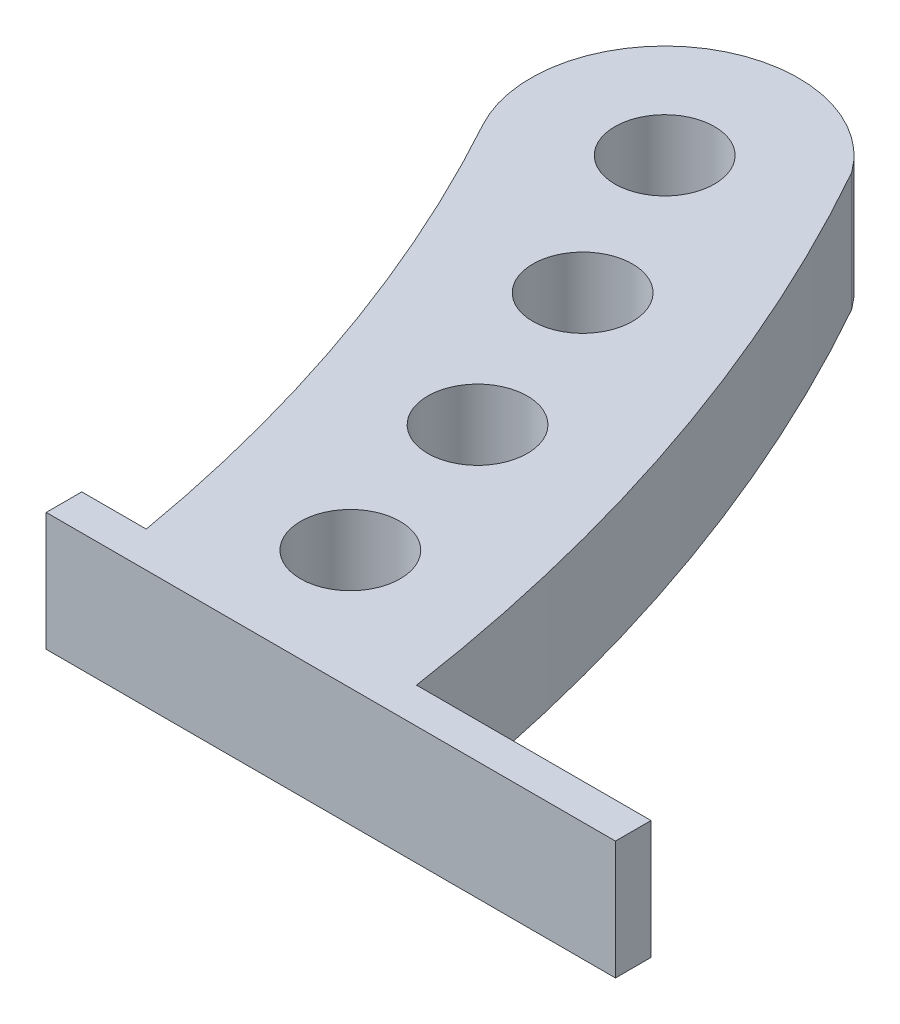
ISO-10303-21;
HEADER;
FILE_DESCRIPTION(('STEP AP214'),'2;1');
FILE_NAME('part.step','',(''),(''),'','','');
FILE_SCHEMA(('AUTOMOTIVE_DESIGN { 1 0 10303 214 1 1 1 1 }'));
ENDSEC;
DATA;
#1=APPLICATION_CONTEXT('core data for automotive mechanical design processes');
#2=APPLICATION_PROTOCOL_DEFINITION('international standard','automotive_design',2000,#1);
#3=PRODUCT_CONTEXT('',#1,'mechanical');
#4=PRODUCT('Part','Part','',(#3));
#5=PRODUCT_RELATED_PRODUCT_CATEGORY('part','',(#4));
#6=PRODUCT_DEFINITION_FORMATION('','',#4);
#7=PRODUCT_DEFINITION_CONTEXT('part definition',#1,'design');
#8=PRODUCT_DEFINITION('design','',#6,#7);
#9=PRODUCT_DEFINITION_SHAPE('','',#8);
#10=(LENGTH_UNIT() NAMED_UNIT(*) SI_UNIT(.MILLI.,.METRE.));
#11=(NAMED_UNIT(*) PLANE_ANGLE_UNIT() SI_UNIT($,.RADIAN.));
#12=(NAMED_UNIT(*) SI_UNIT($,.STERADIAN.) SOLID_ANGLE_UNIT());
#13=UNCERTAINTY_MEASURE_WITH_UNIT(LENGTH_MEASURE(1.E-05),#10,'distance_accuracy_value','');
#14=(GEOMETRIC_REPRESENTATION_CONTEXT(3) GLOBAL_UNCERTAINTY_ASSIGNED_CONTEXT((#13)) GLOBAL_UNIT_ASSIGNED_CONTEXT((#10,
#11,#12)) REPRESENTATION_CONTEXT('',''));
#15=CARTESIAN_POINT('',(0.,0.,0.));
#16=DIRECTION('',(0.,0.,1.));
#17=DIRECTION('',(1.,0.,0.));
#18=AXIS2_PLACEMENT_3D('',#15,#16,#17);
#19=CARTESIAN_POINT('',(0.,10.,0.));
#20=DIRECTION('',(0.,-1.,0.));
#21=DIRECTION('',(0.,0.,-1.));
#22=AXIS2_PLACEMENT_3D('',#19,#20,#21);
#23=CYLINDRICAL_SURFACE('',#22,163.);
#24=CARTESIAN_POINT('',(0.,0.,0.));
#25=DIRECTION('',(0.,1.,0.));
#26=DIRECTION('',(0.,0.,1.));
#27=AXIS2_PLACEMENT_3D('',#24,#25,#26);
#28=CIRCLE('',#27,163.);
#29=CARTESIAN_POINT('',(161.223447426235,0.,-24.));
#30=VERTEX_POINT('',#29);
#31=CARTESIAN_POINT('',(142.147106039343,0.,-79.7696699544364));
#32=VERTEX_POINT('',#31);
#33=EDGE_CURVE('E145',#30,#32,#28,.T.);
#34=ORIENTED_EDGE('',*,*,#33,.T.);
#35=DIRECTION('',(0.,-1.,0.));
#36=VECTOR('',#35,1.);
#37=CARTESIAN_POINT('',(142.147106039343,10.,-79.7696699544364));
#38=LINE('',#37,#36);
#39=CARTESIAN_POINT('',(142.147106039343,10.,-79.7696699544364));
#40=VERTEX_POINT('',#39);
#41=EDGE_CURVE('E11',#40,#32,#38,.T.);
#42=ORIENTED_EDGE('',*,*,#41,.F.);
#43=CARTESIAN_POINT('',(0.,10.,0.));
#44=DIRECTION('',(0.,1.,0.));
#45=DIRECTION('',(0.,0.,1.));
#46=AXIS2_PLACEMENT_3D('',#43,#44,#45);
#47=CIRCLE('',#46,163.);
#48=CARTESIAN_POINT('',(161.223447426235,10.,-24.));
#49=VERTEX_POINT('',#48);
#50=EDGE_CURVE('E190',#49,#40,#47,.T.);
#51=ORIENTED_EDGE('',*,*,#50,.F.);
#52=DIRECTION('',(0.,-1.,0.));
#53=VECTOR('',#52,1.);
#54=CARTESIAN_POINT('',(161.223447426235,10.,-24.));
#55=LINE('',#54,#53);
#56=EDGE_CURVE('E52',#49,#30,#55,.T.);
#57=ORIENTED_EDGE('',*,*,#56,.T.);
#58=EDGE_LOOP('',(#34,#42,#51,#57));
#59=FACE_BOUND('',#58,.T.);
#60=ADVANCED_FACE('F35',(#59),#23,.T.);
#61=CARTESIAN_POINT('',(133.,10.,-73.1519247867067));
#62=DIRECTION('',(0.,-1.,0.));
#63=DIRECTION('',(0.,0.,-1.));
#64=AXIS2_PLACEMENT_3D('',#61,#62,#63);
#65=CYLINDRICAL_SURFACE('',#64,11.2900000000001);
#66=CARTESIAN_POINT('',(133.,0.,-73.1519247867067));
#67=DIRECTION('',(0.,1.,0.));
#68=DIRECTION('',(0.,0.,1.));
#69=AXIS2_PLACEMENT_3D('',#66,#67,#68);
#70=CIRCLE('',#69,11.2900000000001);
#71=CARTESIAN_POINT('',(123.10758284472,0.,-67.7109521874451));
#72=VERTEX_POINT('',#71);
#73=EDGE_CURVE('E147',#32,#72,#70,.T.);
#74=ORIENTED_EDGE('',*,*,#73,.T.);
#75=DIRECTION('',(0.,-1.,0.));
#76=VECTOR('',#75,1.);
#77=CARTESIAN_POINT('',(123.10758284472,10.,-67.7109521874451));
#78=LINE('',#77,#76);
#79=CARTESIAN_POINT('',(123.10758284472,10.,-67.7109521874451));
#80=VERTEX_POINT('',#79);
#81=EDGE_CURVE('E44',#80,#72,#78,.T.);
#82=ORIENTED_EDGE('',*,*,#81,.F.);
#83=CARTESIAN_POINT('',(133.,10.,-73.1519247867067));
#84=DIRECTION('',(0.,1.,0.));
#85=DIRECTION('',(0.,0.,1.));
#86=AXIS2_PLACEMENT_3D('',#83,#84,#85);
#87=CIRCLE('',#86,11.2900000000001);
#88=EDGE_CURVE('E90',#40,#80,#87,.T.);
#89=ORIENTED_EDGE('',*,*,#88,.F.);
#90=ORIENTED_EDGE('',*,*,#41,.T.);
#91=EDGE_LOOP('',(#74,#82,#89,#90));
#92=FACE_BOUND('',#91,.T.);
#93=ADVANCED_FACE('F178',(#92),#65,.T.);
#94=CARTESIAN_POINT('',(0.,10.,0.));
#95=DIRECTION('',(0.,-1.,0.));
#96=DIRECTION('',(0.,0.,-1.));
#97=AXIS2_PLACEMENT_3D('',#94,#95,#96);
#98=CYLINDRICAL_SURFACE('',#97,140.5);
#99=CARTESIAN_POINT('',(0.,0.,0.));
#100=DIRECTION('',(0.,1.,0.));
#101=DIRECTION('',(0.,0.,1.));
#102=AXIS2_PLACEMENT_3D('',#99,#100,#101);
#103=CIRCLE('',#102,140.5);
#104=CARTESIAN_POINT('',(138.435002799148,0.,-24.));
#105=VERTEX_POINT('',#104);
#106=EDGE_CURVE('E150',#105,#72,#103,.T.);
#107=ORIENTED_EDGE('',*,*,#106,.F.);
#108=DIRECTION('',(0.,-1.,0.));
#109=VECTOR('',#108,1.);
#110=CARTESIAN_POINT('',(138.435002799148,10.,-24.));
#111=LINE('',#110,#109);
#112=CARTESIAN_POINT('',(138.435002799148,10.,-24.));
#113=VERTEX_POINT('',#112);
#114=EDGE_CURVE('E171',#113,#105,#111,.T.);
#115=ORIENTED_EDGE('',*,*,#114,.F.);
#116=CARTESIAN_POINT('',(0.,10.,0.));
#117=DIRECTION('',(0.,1.,0.));
#118=DIRECTION('',(0.,0.,1.));
#119=AXIS2_PLACEMENT_3D('',#116,#117,#118);
#120=CIRCLE('',#119,140.5);
#121=EDGE_CURVE('E177',#113,#80,#120,.T.);
#122=ORIENTED_EDGE('',*,*,#121,.T.);
#123=ORIENTED_EDGE('',*,*,#81,.T.);
#124=EDGE_LOOP('',(#107,#115,#122,#123));
#125=FACE_BOUND('',#124,.T.);
#126=ADVANCED_FACE('F175',(#125),#98,.F.);
#127=CARTESIAN_POINT('',(0.,10.,-24.));
#128=DIRECTION('',(0.,0.,-1.));
#129=DIRECTION('',(-1.,0.,0.));
#130=AXIS2_PLACEMENT_3D('',#127,#128,#129);
#131=PLANE('',#130);
#132=DIRECTION('',(1.,0.,0.));
#133=VECTOR('',#132,1.);
#134=CARTESIAN_POINT('',(0.,0.,-24.));
#135=LINE('',#134,#133);
#136=CARTESIAN_POINT('',(133.,0.,-24.));
#137=VERTEX_POINT('',#136);
#138=EDGE_CURVE('E153',#137,#105,#135,.T.);
#139=ORIENTED_EDGE('',*,*,#138,.F.);
#140=DIRECTION('',(0.,-1.,0.));
#141=VECTOR('',#140,1.);
#142=CARTESIAN_POINT('',(133.,10.,-24.));
#143=LINE('',#142,#141);
#144=CARTESIAN_POINT('',(133.,10.,-24.));
#145=VERTEX_POINT('',#144);
#146=EDGE_CURVE('E169',#145,#137,#143,.T.);
#147=ORIENTED_EDGE('',*,*,#146,.F.);
#148=DIRECTION('',(1.,0.,0.));
#149=VECTOR('',#148,1.);
#150=CARTESIAN_POINT('',(0.,10.,-24.));
#151=LINE('',#150,#149);
#152=EDGE_CURVE('E187',#145,#113,#151,.T.);
#153=ORIENTED_EDGE('',*,*,#152,.T.);
#154=ORIENTED_EDGE('',*,*,#114,.T.);
#155=EDGE_LOOP('',(#139,#147,#153,#154));
#156=FACE_BOUND('',#155,.T.);
#157=ADVANCED_FACE('F185',(#156),#131,.T.);
#158=CARTESIAN_POINT('',(133.,10.,0.));
#159=DIRECTION('',(-1.,0.,0.));
#160=DIRECTION('',(0.,0.,1.));
#161=AXIS2_PLACEMENT_3D('',#158,#159,#160);
#162=PLANE('',#161);
#163=DIRECTION('',(0.,0.,-1.));
#164=VECTOR('',#163,1.);
#165=CARTESIAN_POINT('',(133.,0.,0.));
#166=LINE('',#165,#164);
#167=CARTESIAN_POINT('',(133.,0.,-21.));
#168=VERTEX_POINT('',#167);
#169=EDGE_CURVE('E156',#168,#137,#166,.T.);
#170=ORIENTED_EDGE('',*,*,#169,.F.);
#171=DIRECTION('',(0.,-1.,0.));
#172=VECTOR('',#171,1.);
#173=CARTESIAN_POINT('',(133.,10.,-21.));
#174=LINE('',#173,#172);
#175=CARTESIAN_POINT('',(133.,10.,-21.));
#176=VERTEX_POINT('',#175);
#177=EDGE_CURVE('E125',#176,#168,#174,.T.);
#178=ORIENTED_EDGE('',*,*,#177,.F.);
#179=DIRECTION('',(0.,0.,-1.));
#180=VECTOR('',#179,1.);
#181=CARTESIAN_POINT('',(133.,10.,0.));
#182=LINE('',#181,#180);
#183=EDGE_CURVE('E115',#176,#145,#182,.T.);
#184=ORIENTED_EDGE('',*,*,#183,.T.);
#185=ORIENTED_EDGE('',*,*,#146,.T.);
#186=EDGE_LOOP('',(#170,#178,#184,#185));
#187=FACE_BOUND('',#186,.T.);
#188=ADVANCED_FACE('F194',(#187),#162,.T.);
#189=CARTESIAN_POINT('',(0.,10.,-21.));
#190=DIRECTION('',(0.,0.,-1.));
#191=DIRECTION('',(-1.,0.,0.));
#192=AXIS2_PLACEMENT_3D('',#189,#190,#191);
#193=PLANE('',#192);
#194=DIRECTION('',(1.,0.,0.));
#195=VECTOR('',#194,1.);
#196=CARTESIAN_POINT('',(0.,0.,-21.));
#197=LINE('',#196,#195);
#198=CARTESIAN_POINT('',(181.,0.,-21.));
#199=VERTEX_POINT('',#198);
#200=EDGE_CURVE('E122',#168,#199,#197,.T.);
#201=ORIENTED_EDGE('',*,*,#200,.T.);
#202=DIRECTION('',(0.,-1.,0.));
#203=VECTOR('',#202,1.);
#204=CARTESIAN_POINT('',(181.,10.,-21.));
#205=LINE('',#204,#203);
#206=CARTESIAN_POINT('',(181.,10.,-21.));
#207=VERTEX_POINT('',#206);
#208=EDGE_CURVE('E119',#207,#199,#205,.T.);
#209=ORIENTED_EDGE('',*,*,#208,.F.);
#210=DIRECTION('',(1.,0.,0.));
#211=VECTOR('',#210,1.);
#212=CARTESIAN_POINT('',(0.,10.,-21.));
#213=LINE('',#212,#211);
#214=EDGE_CURVE('E107',#176,#207,#213,.T.);
#215=ORIENTED_EDGE('',*,*,#214,.F.);
#216=ORIENTED_EDGE('',*,*,#177,.T.);
#217=EDGE_LOOP('',(#201,#209,#215,#216));
#218=FACE_BOUND('',#217,.T.);
#219=ADVANCED_FACE('F120',(#218),#193,.F.);
#220=CARTESIAN_POINT('',(181.,10.,0.));
#221=DIRECTION('',(1.,0.,0.));
#222=DIRECTION('',(0.,0.,-1.));
#223=AXIS2_PLACEMENT_3D('',#220,#221,#222);
#224=PLANE('',#223);
#225=DIRECTION('',(0.,0.,1.));
#226=VECTOR('',#225,1.);
#227=CARTESIAN_POINT('',(181.,0.,0.));
#228=LINE('',#227,#226);
#229=CARTESIAN_POINT('',(181.,0.,-24.));
#230=VERTEX_POINT('',#229);
#231=EDGE_CURVE('E160',#230,#199,#228,.T.);
#232=ORIENTED_EDGE('',*,*,#231,.F.);
#233=DIRECTION('',(0.,-1.,0.));
#234=VECTOR('',#233,1.);
#235=CARTESIAN_POINT('',(181.,10.,-24.));
#236=LINE('',#235,#234);
#237=CARTESIAN_POINT('',(181.,10.,-24.));
#238=VERTEX_POINT('',#237);
#239=EDGE_CURVE('E78',#238,#230,#236,.T.);
#240=ORIENTED_EDGE('',*,*,#239,.F.);
#241=DIRECTION('',(0.,0.,1.));
#242=VECTOR('',#241,1.);
#243=CARTESIAN_POINT('',(181.,10.,0.));
#244=LINE('',#243,#242);
#245=EDGE_CURVE('E112',#238,#207,#244,.T.);
#246=ORIENTED_EDGE('',*,*,#245,.T.);
#247=ORIENTED_EDGE('',*,*,#208,.T.);
#248=EDGE_LOOP('',(#232,#240,#246,#247));
#249=FACE_BOUND('',#248,.T.);
#250=ADVANCED_FACE('F127',(#249),#224,.T.);
#251=CARTESIAN_POINT('',(133.,10.,-73.1519247867067));
#252=DIRECTION('',(0.,-1.,0.));
#253=DIRECTION('',(0.,0.,-1.));
#254=AXIS2_PLACEMENT_3D('',#251,#252,#253);
#255=CYLINDRICAL_SURFACE('',#254,4.20000000000009);
#256=CARTESIAN_POINT('',(133.,10.,-73.1519247867067));
#257=DIRECTION('',(0.,1.,0.));
#258=DIRECTION('',(0.,0.,1.));
#259=AXIS2_PLACEMENT_3D('',#256,#257,#258);
#260=CIRCLE('',#259,4.20000000000009);
#261=CARTESIAN_POINT('',(133.,10.,-68.9519247867066));
#262=VERTEX_POINT('',#261);
#263=EDGE_CURVE('E345',#262,#262,#260,.T.);
#264=ORIENTED_EDGE('',*,*,#263,.T.);
#265=EDGE_LOOP('',(#264));
#266=FACE_BOUND('',#265,.T.);
#267=CARTESIAN_POINT('',(133.,0.,-73.1519247867067));
#268=DIRECTION('',(0.,1.,0.));
#269=DIRECTION('',(0.,0.,1.));
#270=AXIS2_PLACEMENT_3D('',#267,#268,#269);
#271=CIRCLE('',#270,4.20000000000009);
#272=CARTESIAN_POINT('',(133.,0.,-68.9519247867066));
#273=VERTEX_POINT('',#272);
#274=EDGE_CURVE('E142',#273,#273,#271,.T.);
#275=ORIENTED_EDGE('',*,*,#274,.F.);
#276=EDGE_LOOP('',(#275));
#277=FACE_BOUND('',#276,.T.);
#278=ADVANCED_FACE('F216',(#266,#277),#255,.F.);
#279=CARTESIAN_POINT('',(139.573135395561,10.,-59.6619139472775));
#280=DIRECTION('',(0.,-1.,0.));
#281=DIRECTION('',(0.,0.,-1.));
#282=AXIS2_PLACEMENT_3D('',#279,#280,#281);
#283=CYLINDRICAL_SURFACE('',#282,4.20000000000008);
#284=CARTESIAN_POINT('',(139.573135395561,10.,-59.6619139472775));
#285=DIRECTION('',(0.,1.,0.));
#286=DIRECTION('',(0.,0.,1.));
#287=AXIS2_PLACEMENT_3D('',#284,#285,#286);
#288=CIRCLE('',#287,4.20000000000008);
#289=CARTESIAN_POINT('',(139.573135395561,10.,-55.4619139472774));
#290=VERTEX_POINT('',#289);
#291=EDGE_CURVE('E342',#290,#290,#288,.T.);
#292=ORIENTED_EDGE('',*,*,#291,.T.);
#293=EDGE_LOOP('',(#292));
#294=FACE_BOUND('',#293,.T.);
#295=CARTESIAN_POINT('',(139.573135395561,0.,-59.6619139472775));
#296=DIRECTION('',(0.,1.,0.));
#297=DIRECTION('',(0.,0.,1.));
#298=AXIS2_PLACEMENT_3D('',#295,#296,#297);
#299=CIRCLE('',#298,4.20000000000008);
#300=CARTESIAN_POINT('',(139.573135395561,0.,-55.4619139472774));
#301=VERTEX_POINT('',#300);
#302=EDGE_CURVE('E139',#301,#301,#299,.T.);
#303=ORIENTED_EDGE('',*,*,#302,.F.);
#304=EDGE_LOOP('',(#303));
#305=FACE_BOUND('',#304,.T.);
#306=ADVANCED_FACE('F219',(#294,#305),#283,.F.);
#307=CARTESIAN_POINT('',(144.78213417543,10.,-45.5887894510035));
#308=DIRECTION('',(0.,-1.,0.));
#309=DIRECTION('',(0.,0.,-1.));
#310=AXIS2_PLACEMENT_3D('',#307,#308,#309);
#311=CYLINDRICAL_SURFACE('',#310,4.20000000000008);
#312=CARTESIAN_POINT('',(144.78213417543,10.,-45.5887894510035));
#313=DIRECTION('',(0.,1.,0.));
#314=DIRECTION('',(0.,0.,1.));
#315=AXIS2_PLACEMENT_3D('',#312,#313,#314);
#316=CIRCLE('',#315,4.20000000000008);
#317=CARTESIAN_POINT('',(144.78213417543,10.,-41.3887894510035));
#318=VERTEX_POINT('',#317);
#319=EDGE_CURVE('E230',#318,#318,#316,.T.);
#320=ORIENTED_EDGE('',*,*,#319,.T.);
#321=EDGE_LOOP('',(#320));
#322=FACE_BOUND('',#321,.T.);
#323=CARTESIAN_POINT('',(144.78213417543,0.,-45.5887894510035));
#324=DIRECTION('',(0.,1.,0.));
#325=DIRECTION('',(0.,0.,1.));
#326=AXIS2_PLACEMENT_3D('',#323,#324,#325);
#327=CIRCLE('',#326,4.20000000000008);
#328=CARTESIAN_POINT('',(144.78213417543,0.,-41.3887894510035));
#329=VERTEX_POINT('',#328);
#330=EDGE_CURVE('E136',#329,#329,#327,.T.);
#331=ORIENTED_EDGE('',*,*,#330,.F.);
#332=EDGE_LOOP('',(#331));
#333=FACE_BOUND('',#332,.T.);
#334=ADVANCED_FACE('F204',(#322,#333),#311,.F.);
#335=CARTESIAN_POINT('',(148.576085496723,10.,-31.0700968532538));
#336=DIRECTION('',(0.,-1.,0.));
#337=DIRECTION('',(0.,0.,-1.));
#338=AXIS2_PLACEMENT_3D('',#335,#336,#337);
#339=CYLINDRICAL_SURFACE('',#338,4.20000000000009);
#340=CARTESIAN_POINT('',(148.576085496723,10.,-31.0700968532538));
#341=DIRECTION('',(0.,1.,0.));
#342=DIRECTION('',(0.,0.,1.));
#343=AXIS2_PLACEMENT_3D('',#340,#341,#342);
#344=CIRCLE('',#343,4.20000000000009);
#345=CARTESIAN_POINT('',(148.576085496723,10.,-26.8700968532537));
#346=VERTEX_POINT('',#345);
#347=EDGE_CURVE('E165',#346,#346,#344,.T.);
#348=ORIENTED_EDGE('',*,*,#347,.T.);
#349=EDGE_LOOP('',(#348));
#350=FACE_BOUND('',#349,.T.);
#351=CARTESIAN_POINT('',(148.576085496723,0.,-31.0700968532538));
#352=DIRECTION('',(0.,1.,0.));
#353=DIRECTION('',(0.,0.,1.));
#354=AXIS2_PLACEMENT_3D('',#351,#352,#353);
#355=CIRCLE('',#354,4.20000000000009);
#356=CARTESIAN_POINT('',(148.576085496723,0.,-26.8700968532537));
#357=VERTEX_POINT('',#356);
#358=EDGE_CURVE('E133',#357,#357,#355,.T.);
#359=ORIENTED_EDGE('',*,*,#358,.F.);
#360=EDGE_LOOP('',(#359));
#361=FACE_BOUND('',#360,.T.);
#362=ADVANCED_FACE('F37',(#350,#361),#339,.F.);
#363=CARTESIAN_POINT('',(0.,10.,-24.));
#364=DIRECTION('',(0.,0.,-1.));
#365=DIRECTION('',(-1.,0.,0.));
#366=AXIS2_PLACEMENT_3D('',#363,#364,#365);
#367=PLANE('',#366);
#368=DIRECTION('',(1.,0.,0.));
#369=VECTOR('',#368,1.);
#370=CARTESIAN_POINT('',(0.,0.,-24.));
#371=LINE('',#370,#369);
#372=EDGE_CURVE('E162',#30,#230,#371,.T.);
#373=ORIENTED_EDGE('',*,*,#372,.F.);
#374=ORIENTED_EDGE('',*,*,#56,.F.);
#375=DIRECTION('',(1.,0.,0.));
#376=VECTOR('',#375,1.);
#377=CARTESIAN_POINT('',(0.,10.,-24.));
#378=LINE('',#377,#376);
#379=EDGE_CURVE('E128',#49,#238,#378,.T.);
#380=ORIENTED_EDGE('',*,*,#379,.T.);
#381=ORIENTED_EDGE('',*,*,#239,.T.);
#382=EDGE_LOOP('',(#373,#374,#380,#381));
#383=FACE_BOUND('',#382,.T.);
#384=ADVANCED_FACE('F195',(#383),#367,.T.);
#385=CARTESIAN_POINT('',(0.,10.,0.));
#386=DIRECTION('',(0.,1.,0.));
#387=DIRECTION('',(0.,0.,1.));
#388=AXIS2_PLACEMENT_3D('',#385,#386,#387);
#389=PLANE('',#388);
#390=ORIENTED_EDGE('',*,*,#347,.F.);
#391=EDGE_LOOP('',(#390));
#392=FACE_BOUND('',#391,.T.);
#393=ORIENTED_EDGE('',*,*,#319,.F.);
#394=EDGE_LOOP('',(#393));
#395=FACE_BOUND('',#394,.T.);
#396=ORIENTED_EDGE('',*,*,#291,.F.);
#397=EDGE_LOOP('',(#396));
#398=FACE_BOUND('',#397,.T.);
#399=ORIENTED_EDGE('',*,*,#263,.F.);
#400=EDGE_LOOP('',(#399));
#401=FACE_BOUND('',#400,.T.);
#402=ORIENTED_EDGE('',*,*,#50,.T.);
#403=ORIENTED_EDGE('',*,*,#88,.T.);
#404=ORIENTED_EDGE('',*,*,#121,.F.);
#405=ORIENTED_EDGE('',*,*,#152,.F.);
#406=ORIENTED_EDGE('',*,*,#183,.F.);
#407=ORIENTED_EDGE('',*,*,#214,.T.);
#408=ORIENTED_EDGE('',*,*,#245,.F.);
#409=ORIENTED_EDGE('',*,*,#379,.F.);
#410=EDGE_LOOP('',(#402,#403,#404,#405,#406,#407,#408,#409));
#411=FACE_BOUND('',#410,.T.);
#412=ADVANCED_FACE('F109',(#392,#395,#398,#401,#411),#389,.T.);
#413=CARTESIAN_POINT('',(0.,0.,0.));
#414=DIRECTION('',(0.,1.,0.));
#415=DIRECTION('',(0.,0.,1.));
#416=AXIS2_PLACEMENT_3D('',#413,#414,#415);
#417=PLANE('',#416);
#418=ORIENTED_EDGE('',*,*,#358,.T.);
#419=EDGE_LOOP('',(#418));
#420=FACE_BOUND('',#419,.T.);
#421=ORIENTED_EDGE('',*,*,#330,.T.);
#422=EDGE_LOOP('',(#421));
#423=FACE_BOUND('',#422,.T.);
#424=ORIENTED_EDGE('',*,*,#302,.T.);
#425=EDGE_LOOP('',(#424));
#426=FACE_BOUND('',#425,.T.);
#427=ORIENTED_EDGE('',*,*,#274,.T.);
#428=EDGE_LOOP('',(#427));
#429=FACE_BOUND('',#428,.T.);
#430=ORIENTED_EDGE('',*,*,#33,.F.);
#431=ORIENTED_EDGE('',*,*,#372,.T.);
#432=ORIENTED_EDGE('',*,*,#231,.T.);
#433=ORIENTED_EDGE('',*,*,#200,.F.);
#434=ORIENTED_EDGE('',*,*,#169,.T.);
#435=ORIENTED_EDGE('',*,*,#138,.T.);
#436=ORIENTED_EDGE('',*,*,#106,.T.);
#437=ORIENTED_EDGE('',*,*,#73,.F.);
#438=EDGE_LOOP('',(#430,#431,#432,#433,#434,#435,#436,#437));
#439=FACE_BOUND('',#438,.T.);
#440=ADVANCED_FACE('F181',(#420,#423,#426,#429,#439),#417,.F.);
#441=CLOSED_SHELL('',(#60,#93,#126,#157,#188,#219,#250,#278,#306,#334,#362,#384,#412,#440));
#442=MANIFOLD_SOLID_BREP('B2',#441);
#443=ADVANCED_BREP_SHAPE_REPRESENTATION('',(#18,#442),#14);
#444=SHAPE_DEFINITION_REPRESENTATION(#9,#443);
ENDSEC;
END-ISO-10303-21;
